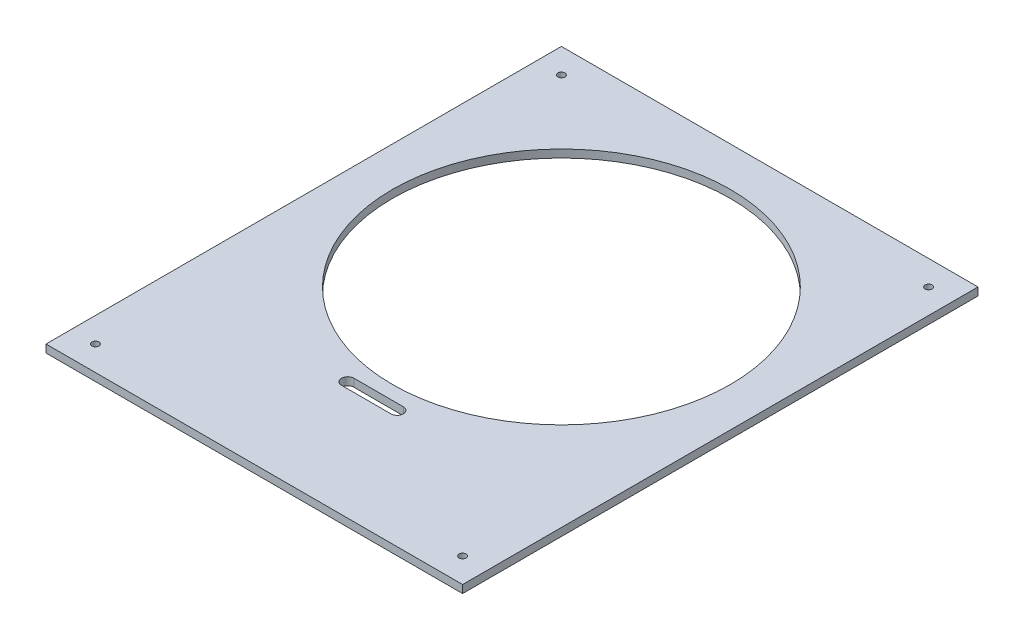
ISO-10303-21;
HEADER;
FILE_DESCRIPTION(('STEP AP214'),'2;1');
FILE_NAME('part.step','',(''),(''),'','','');
FILE_SCHEMA(('AUTOMOTIVE_DESIGN { 1 0 10303 214 1 1 1 1 }'));
ENDSEC;
DATA;
#1=APPLICATION_CONTEXT('core data for automotive mechanical design processes');
#2=APPLICATION_PROTOCOL_DEFINITION('international standard','automotive_design',2000,#1);
#3=PRODUCT_CONTEXT('',#1,'mechanical');
#4=PRODUCT('Part','Part','',(#3));
#5=PRODUCT_RELATED_PRODUCT_CATEGORY('part','',(#4));
#6=PRODUCT_DEFINITION_FORMATION('','',#4);
#7=PRODUCT_DEFINITION_CONTEXT('part definition',#1,'design');
#8=PRODUCT_DEFINITION('design','',#6,#7);
#9=PRODUCT_DEFINITION_SHAPE('','',#8);
#10=(LENGTH_UNIT() NAMED_UNIT(*) SI_UNIT(.MILLI.,.METRE.));
#11=(NAMED_UNIT(*) PLANE_ANGLE_UNIT() SI_UNIT($,.RADIAN.));
#12=(NAMED_UNIT(*) SI_UNIT($,.STERADIAN.) SOLID_ANGLE_UNIT());
#13=UNCERTAINTY_MEASURE_WITH_UNIT(LENGTH_MEASURE(1.E-05),#10,'distance_accuracy_value','');
#14=(GEOMETRIC_REPRESENTATION_CONTEXT(3) GLOBAL_UNCERTAINTY_ASSIGNED_CONTEXT((#13)) GLOBAL_UNIT_ASSIGNED_CONTEXT((#10,
#11,#12)) REPRESENTATION_CONTEXT('',''));
#15=CARTESIAN_POINT('',(0.,0.,0.));
#16=DIRECTION('',(0.,0.,1.));
#17=DIRECTION('',(1.,0.,0.));
#18=AXIS2_PLACEMENT_3D('',#15,#16,#17);
#19=CARTESIAN_POINT('',(0.,3.175,0.));
#20=DIRECTION('',(0.,1.,0.));
#21=DIRECTION('',(0.,0.,1.));
#22=AXIS2_PLACEMENT_3D('',#19,#20,#21);
#23=PLANE('',#22);
#24=CARTESIAN_POINT('',(74.325,3.175,114.325));
#25=DIRECTION('',(0.,1.,0.));
#26=DIRECTION('',(0.,0.,1.));
#27=AXIS2_PLACEMENT_3D('',#24,#25,#26);
#28=CIRCLE('',#27,1.42240000000001);
#29=CARTESIAN_POINT('',(74.325,3.175,115.7474));
#30=VERTEX_POINT('',#29);
#31=EDGE_CURVE('E223',#30,#30,#28,.T.);
#32=ORIENTED_EDGE('',*,*,#31,.F.);
#33=EDGE_LOOP('',(#32));
#34=FACE_BOUND('',#33,.T.);
#35=CARTESIAN_POINT('',(-74.325,3.175,-74.325));
#36=DIRECTION('',(0.,1.,0.));
#37=DIRECTION('',(0.,0.,1.));
#38=AXIS2_PLACEMENT_3D('',#35,#36,#37);
#39=CIRCLE('',#38,1.42240000000001);
#40=CARTESIAN_POINT('',(-74.325,3.175,-72.9026));
#41=VERTEX_POINT('',#40);
#42=EDGE_CURVE('E227',#41,#41,#39,.T.);
#43=ORIENTED_EDGE('',*,*,#42,.F.);
#44=EDGE_LOOP('',(#43));
#45=FACE_BOUND('',#44,.T.);
#46=CARTESIAN_POINT('',(74.3250000000002,3.175,-74.325));
#47=DIRECTION('',(0.,1.,0.));
#48=DIRECTION('',(0.,0.,1.));
#49=AXIS2_PLACEMENT_3D('',#46,#47,#48);
#50=CIRCLE('',#49,1.42240000000001);
#51=CARTESIAN_POINT('',(74.3250000000002,3.175,-72.9026));
#52=VERTEX_POINT('',#51);
#53=EDGE_CURVE('E231',#52,#52,#50,.T.);
#54=ORIENTED_EDGE('',*,*,#53,.F.);
#55=EDGE_LOOP('',(#54));
#56=FACE_BOUND('',#55,.T.);
#57=CARTESIAN_POINT('',(-74.325,3.175,114.325));
#58=DIRECTION('',(0.,1.,0.));
#59=DIRECTION('',(0.,0.,1.));
#60=AXIS2_PLACEMENT_3D('',#57,#58,#59);
#61=CIRCLE('',#60,1.42240000000001);
#62=CARTESIAN_POINT('',(-74.325,3.175,115.7474));
#63=VERTEX_POINT('',#62);
#64=EDGE_CURVE('E235',#63,#63,#61,.T.);
#65=ORIENTED_EDGE('',*,*,#64,.F.);
#66=EDGE_LOOP('',(#65));
#67=FACE_BOUND('',#66,.T.);
#68=CARTESIAN_POINT('',(10.,3.175,76.495));
#69=DIRECTION('',(0.,1.,0.));
#70=DIRECTION('',(0.,0.,1.));
#71=AXIS2_PLACEMENT_3D('',#68,#69,#70);
#72=CIRCLE('',#71,2.5);
#73=CARTESIAN_POINT('',(10.,3.175,78.995));
#74=VERTEX_POINT('',#73);
#75=CARTESIAN_POINT('',(10.,3.175,73.995));
#76=VERTEX_POINT('',#75);
#77=EDGE_CURVE('E52',#74,#76,#72,.T.);
#78=ORIENTED_EDGE('',*,*,#77,.F.);
#79=DIRECTION('',(1.,0.,0.));
#80=VECTOR('',#79,1.);
#81=CARTESIAN_POINT('',(10.,3.175,78.995));
#82=LINE('',#81,#80);
#83=CARTESIAN_POINT('',(-10.,3.175,78.995));
#84=VERTEX_POINT('',#83);
#85=EDGE_CURVE('E146',#84,#74,#82,.T.);
#86=ORIENTED_EDGE('',*,*,#85,.F.);
#87=CARTESIAN_POINT('',(-10.,3.175,76.495));
#88=DIRECTION('',(0.,1.,0.));
#89=DIRECTION('',(0.,0.,1.));
#90=AXIS2_PLACEMENT_3D('',#87,#88,#89);
#91=CIRCLE('',#90,2.5);
#92=CARTESIAN_POINT('',(-10.,3.175,73.995));
#93=VERTEX_POINT('',#92);
#94=EDGE_CURVE('E158',#93,#84,#91,.T.);
#95=ORIENTED_EDGE('',*,*,#94,.F.);
#96=DIRECTION('',(-1.,0.,0.));
#97=VECTOR('',#96,1.);
#98=CARTESIAN_POINT('',(10.,3.175,73.995));
#99=LINE('',#98,#97);
#100=EDGE_CURVE('E155',#76,#93,#99,.T.);
#101=ORIENTED_EDGE('',*,*,#100,.F.);
#102=EDGE_LOOP('',(#78,#86,#95,#101));
#103=FACE_BOUND('',#102,.T.);
#104=DIRECTION('',(0.,0.,1.));
#105=VECTOR('',#104,1.);
#106=CARTESIAN_POINT('',(-84.325,3.175,84.325));
#107=LINE('',#106,#105);
#108=CARTESIAN_POINT('',(-84.325,3.175,-84.325));
#109=VERTEX_POINT('',#108);
#110=CARTESIAN_POINT('',(-84.325,3.175,124.325));
#111=VERTEX_POINT('',#110);
#112=EDGE_CURVE('E176',#109,#111,#107,.T.);
#113=ORIENTED_EDGE('',*,*,#112,.T.);
#114=DIRECTION('',(1.,0.,0.));
#115=VECTOR('',#114,1.);
#116=CARTESIAN_POINT('',(-84.325,3.175,124.325));
#117=LINE('',#116,#115);
#118=CARTESIAN_POINT('',(84.325,3.175,124.325));
#119=VERTEX_POINT('',#118);
#120=EDGE_CURVE('E115',#111,#119,#117,.T.);
#121=ORIENTED_EDGE('',*,*,#120,.T.);
#122=DIRECTION('',(0.,0.,-1.));
#123=VECTOR('',#122,1.);
#124=CARTESIAN_POINT('',(84.325,3.175,84.325));
#125=LINE('',#124,#123);
#126=CARTESIAN_POINT('',(84.325,3.175,-84.325));
#127=VERTEX_POINT('',#126);
#128=EDGE_CURVE('E178',#119,#127,#125,.T.);
#129=ORIENTED_EDGE('',*,*,#128,.T.);
#130=DIRECTION('',(-1.,0.,0.));
#131=VECTOR('',#130,1.);
#132=CARTESIAN_POINT('',(84.325,3.175,-84.325));
#133=LINE('',#132,#131);
#134=EDGE_CURVE('E181',#127,#109,#133,.T.);
#135=ORIENTED_EDGE('',*,*,#134,.T.);
#136=EDGE_LOOP('',(#113,#121,#129,#135));
#137=FACE_BOUND('',#136,.T.);
#138=CARTESIAN_POINT('',(0.,3.175,0.));
#139=DIRECTION('',(0.,1.,0.));
#140=DIRECTION('',(0.,0.,1.));
#141=AXIS2_PLACEMENT_3D('',#138,#139,#140);
#142=CIRCLE('',#141,68.4);
#143=CARTESIAN_POINT('',(0.,3.175,68.4));
#144=VERTEX_POINT('',#143);
#145=EDGE_CURVE('E171',#144,#144,#142,.T.);
#146=ORIENTED_EDGE('',*,*,#145,.F.);
#147=EDGE_LOOP('',(#146));
#148=FACE_BOUND('',#147,.T.);
#149=ADVANCED_FACE('F35',(#34,#45,#56,#67,#103,#137,#148),#23,.T.);
#150=CARTESIAN_POINT('',(0.,0.,0.));
#151=DIRECTION('',(0.,1.,0.));
#152=DIRECTION('',(0.,0.,1.));
#153=AXIS2_PLACEMENT_3D('',#150,#151,#152);
#154=PLANE('',#153);
#155=CARTESIAN_POINT('',(-74.325,0.,-74.325));
#156=DIRECTION('',(0.,1.,0.));
#157=DIRECTION('',(0.,0.,1.));
#158=AXIS2_PLACEMENT_3D('',#155,#156,#157);
#159=CIRCLE('',#158,1.42240000000001);
#160=CARTESIAN_POINT('',(-74.325,0.,-72.9026));
#161=VERTEX_POINT('',#160);
#162=EDGE_CURVE('E39',#161,#161,#159,.T.);
#163=ORIENTED_EDGE('',*,*,#162,.T.);
#164=EDGE_LOOP('',(#163));
#165=FACE_BOUND('',#164,.T.);
#166=CARTESIAN_POINT('',(74.3250000000002,0.,-74.325));
#167=DIRECTION('',(0.,1.,0.));
#168=DIRECTION('',(0.,0.,1.));
#169=AXIS2_PLACEMENT_3D('',#166,#167,#168);
#170=CIRCLE('',#169,1.42240000000001);
#171=CARTESIAN_POINT('',(74.3250000000002,0.,-72.9026));
#172=VERTEX_POINT('',#171);
#173=EDGE_CURVE('E285',#172,#172,#170,.T.);
#174=ORIENTED_EDGE('',*,*,#173,.T.);
#175=EDGE_LOOP('',(#174));
#176=FACE_BOUND('',#175,.T.);
#177=DIRECTION('',(1.,0.,0.));
#178=VECTOR('',#177,1.);
#179=CARTESIAN_POINT('',(10.,0.,78.995));
#180=LINE('',#179,#178);
#181=CARTESIAN_POINT('',(-10.,0.,78.995));
#182=VERTEX_POINT('',#181);
#183=CARTESIAN_POINT('',(10.,0.,78.995));
#184=VERTEX_POINT('',#183);
#185=EDGE_CURVE('E150',#182,#184,#180,.T.);
#186=ORIENTED_EDGE('',*,*,#185,.T.);
#187=CARTESIAN_POINT('',(10.,0.,76.495));
#188=DIRECTION('',(0.,1.,0.));
#189=DIRECTION('',(0.,0.,1.));
#190=AXIS2_PLACEMENT_3D('',#187,#188,#189);
#191=CIRCLE('',#190,2.5);
#192=CARTESIAN_POINT('',(10.,0.,73.995));
#193=VERTEX_POINT('',#192);
#194=EDGE_CURVE('E142',#184,#193,#191,.T.);
#195=ORIENTED_EDGE('',*,*,#194,.T.);
#196=DIRECTION('',(-1.,0.,0.));
#197=VECTOR('',#196,1.);
#198=CARTESIAN_POINT('',(10.,0.,73.995));
#199=LINE('',#198,#197);
#200=CARTESIAN_POINT('',(-10.,0.,73.995));
#201=VERTEX_POINT('',#200);
#202=EDGE_CURVE('E145',#193,#201,#199,.T.);
#203=ORIENTED_EDGE('',*,*,#202,.T.);
#204=CARTESIAN_POINT('',(-10.,0.,76.495));
#205=DIRECTION('',(0.,1.,0.));
#206=DIRECTION('',(0.,0.,1.));
#207=AXIS2_PLACEMENT_3D('',#204,#205,#206);
#208=CIRCLE('',#207,2.5);
#209=EDGE_CURVE('E60',#201,#182,#208,.T.);
#210=ORIENTED_EDGE('',*,*,#209,.T.);
#211=EDGE_LOOP('',(#186,#195,#203,#210));
#212=FACE_BOUND('',#211,.T.);
#213=DIRECTION('',(0.,0.,1.));
#214=VECTOR('',#213,1.);
#215=CARTESIAN_POINT('',(-84.325,0.,84.325));
#216=LINE('',#215,#214);
#217=CARTESIAN_POINT('',(-84.325,0.,-84.325));
#218=VERTEX_POINT('',#217);
#219=CARTESIAN_POINT('',(-84.325,-0.00250000000000011,84.325));
#220=VERTEX_POINT('',#219);
#221=EDGE_CURVE('E132',#218,#220,#216,.T.);
#222=ORIENTED_EDGE('',*,*,#221,.F.);
#223=DIRECTION('',(-1.,0.,0.));
#224=VECTOR('',#223,1.);
#225=CARTESIAN_POINT('',(84.325,0.,-84.325));
#226=LINE('',#225,#224);
#227=CARTESIAN_POINT('',(84.325,0.,-84.325));
#228=VERTEX_POINT('',#227);
#229=EDGE_CURVE('E179',#228,#218,#226,.T.);
#230=ORIENTED_EDGE('',*,*,#229,.F.);
#231=DIRECTION('',(0.,0.,-1.));
#232=VECTOR('',#231,1.);
#233=CARTESIAN_POINT('',(84.325,0.,84.325));
#234=LINE('',#233,#232);
#235=CARTESIAN_POINT('',(84.325,-0.00250000000000011,84.325));
#236=VERTEX_POINT('',#235);
#237=EDGE_CURVE('E184',#236,#228,#234,.T.);
#238=ORIENTED_EDGE('',*,*,#237,.F.);
#239=CARTESIAN_POINT('',(-84.325,-0.00500000000000023,84.325));
#240=DIRECTION('',(1.,0.,0.));
#241=VECTOR('',#240,1.);
#242=LINE('',#239,#241);
#243=EDGE_CURVE('E188',#220,#236,#242,.T.);
#244=ORIENTED_EDGE('',*,*,#243,.F.);
#245=EDGE_LOOP('',(#222,#230,#238,#244));
#246=FACE_BOUND('',#245,.T.);
#247=CARTESIAN_POINT('',(0.,0.,0.));
#248=DIRECTION('',(0.,1.,0.));
#249=DIRECTION('',(0.,0.,1.));
#250=AXIS2_PLACEMENT_3D('',#247,#248,#249);
#251=CIRCLE('',#250,68.4);
#252=CARTESIAN_POINT('',(0.,0.,68.4));
#253=VERTEX_POINT('',#252);
#254=EDGE_CURVE('E165',#253,#253,#251,.T.);
#255=ORIENTED_EDGE('',*,*,#254,.T.);
#256=EDGE_LOOP('',(#255));
#257=FACE_BOUND('',#256,.T.);
#258=ADVANCED_FACE('F194',(#165,#176,#212,#246,#257),#154,.F.);
#259=CARTESIAN_POINT('',(-84.325,3.175,84.325));
#260=DIRECTION('',(1.,0.,0.));
#261=DIRECTION('',(0.,0.,-1.));
#262=AXIS2_PLACEMENT_3D('',#259,#260,#261);
#263=PLANE('',#262);
#264=ORIENTED_EDGE('',*,*,#221,.T.);
#265=DIRECTION('',(0.,0.,1.));
#266=VECTOR('',#265,1.);
#267=CARTESIAN_POINT('',(-84.325,-0.00500000000000023,84.325));
#268=LINE('',#267,#266);
#269=CARTESIAN_POINT('',(-84.325,-0.00500000000000023,124.325));
#270=VERTEX_POINT('',#269);
#271=EDGE_CURVE('E127',#220,#270,#268,.T.);
#272=ORIENTED_EDGE('',*,*,#271,.T.);
#273=DIRECTION('',(0.,1.,0.));
#274=VECTOR('',#273,1.);
#275=CARTESIAN_POINT('',(-84.325,-0.00500000000000023,124.325));
#276=LINE('',#275,#274);
#277=EDGE_CURVE('E109',#270,#111,#276,.T.);
#278=ORIENTED_EDGE('',*,*,#277,.T.);
#279=ORIENTED_EDGE('',*,*,#112,.F.);
#280=DIRECTION('',(0.,-1.,0.));
#281=VECTOR('',#280,1.);
#282=CARTESIAN_POINT('',(-84.325,3.175,-84.325));
#283=LINE('',#282,#281);
#284=EDGE_CURVE('E44',#109,#218,#283,.T.);
#285=ORIENTED_EDGE('',*,*,#284,.T.);
#286=EDGE_LOOP('',(#264,#272,#278,#279,#285));
#287=FACE_BOUND('',#286,.T.);
#288=ADVANCED_FACE('F37',(#287),#263,.F.);
#289=CARTESIAN_POINT('',(84.325,3.175,84.325));
#290=DIRECTION('',(-1.,0.,0.));
#291=DIRECTION('',(0.,0.,1.));
#292=AXIS2_PLACEMENT_3D('',#289,#290,#291);
#293=PLANE('',#292);
#294=ORIENTED_EDGE('',*,*,#237,.T.);
#295=DIRECTION('',(0.,-1.,0.));
#296=VECTOR('',#295,1.);
#297=CARTESIAN_POINT('',(84.325,3.175,-84.325));
#298=LINE('',#297,#296);
#299=EDGE_CURVE('E11',#127,#228,#298,.T.);
#300=ORIENTED_EDGE('',*,*,#299,.F.);
#301=ORIENTED_EDGE('',*,*,#128,.F.);
#302=DIRECTION('',(0.,1.,0.));
#303=VECTOR('',#302,1.);
#304=CARTESIAN_POINT('',(84.325,-0.00500000000000023,124.325));
#305=LINE('',#304,#303);
#306=CARTESIAN_POINT('',(84.325,-0.00500000000000023,124.325));
#307=VERTEX_POINT('',#306);
#308=EDGE_CURVE('E119',#307,#119,#305,.T.);
#309=ORIENTED_EDGE('',*,*,#308,.F.);
#310=DIRECTION('',(0.,0.,-1.));
#311=VECTOR('',#310,1.);
#312=CARTESIAN_POINT('',(84.325,-0.00500000000000023,84.325));
#313=LINE('',#312,#311);
#314=EDGE_CURVE('E120',#307,#236,#313,.T.);
#315=ORIENTED_EDGE('',*,*,#314,.T.);
#316=EDGE_LOOP('',(#294,#300,#301,#309,#315));
#317=FACE_BOUND('',#316,.T.);
#318=ADVANCED_FACE('F209',(#317),#293,.F.);
#319=CARTESIAN_POINT('',(84.325,3.175,-84.325));
#320=DIRECTION('',(0.,0.,1.));
#321=DIRECTION('',(1.,0.,0.));
#322=AXIS2_PLACEMENT_3D('',#319,#320,#321);
#323=PLANE('',#322);
#324=ORIENTED_EDGE('',*,*,#229,.T.);
#325=ORIENTED_EDGE('',*,*,#284,.F.);
#326=ORIENTED_EDGE('',*,*,#134,.F.);
#327=ORIENTED_EDGE('',*,*,#299,.T.);
#328=EDGE_LOOP('',(#324,#325,#326,#327));
#329=FACE_BOUND('',#328,.T.);
#330=ADVANCED_FACE('F206',(#329),#323,.F.);
#331=CARTESIAN_POINT('',(0.,3.175,0.));
#332=DIRECTION('',(0.,-1.,0.));
#333=DIRECTION('',(0.,0.,-1.));
#334=AXIS2_PLACEMENT_3D('',#331,#332,#333);
#335=CYLINDRICAL_SURFACE('',#334,68.4);
#336=ORIENTED_EDGE('',*,*,#145,.T.);
#337=EDGE_LOOP('',(#336));
#338=FACE_BOUND('',#337,.T.);
#339=ORIENTED_EDGE('',*,*,#254,.F.);
#340=EDGE_LOOP('',(#339));
#341=FACE_BOUND('',#340,.T.);
#342=ADVANCED_FACE('F208',(#338,#341),#335,.F.);
#343=CARTESIAN_POINT('',(10.,0.,76.495));
#344=DIRECTION('',(0.,1.,0.));
#345=DIRECTION('',(0.,0.,1.));
#346=AXIS2_PLACEMENT_3D('',#343,#344,#345);
#347=CYLINDRICAL_SURFACE('',#346,2.5);
#348=ORIENTED_EDGE('',*,*,#77,.T.);
#349=DIRECTION('',(0.,1.,0.));
#350=VECTOR('',#349,1.);
#351=CARTESIAN_POINT('',(10.,0.,73.995));
#352=LINE('',#351,#350);
#353=EDGE_CURVE('E153',#193,#76,#352,.T.);
#354=ORIENTED_EDGE('',*,*,#353,.F.);
#355=ORIENTED_EDGE('',*,*,#194,.F.);
#356=DIRECTION('',(0.,1.,0.));
#357=VECTOR('',#356,1.);
#358=CARTESIAN_POINT('',(10.,0.,78.995));
#359=LINE('',#358,#357);
#360=EDGE_CURVE('E163',#184,#74,#359,.T.);
#361=ORIENTED_EDGE('',*,*,#360,.T.);
#362=EDGE_LOOP('',(#348,#354,#355,#361));
#363=FACE_BOUND('',#362,.T.);
#364=ADVANCED_FACE('F244',(#363),#347,.F.);
#365=CARTESIAN_POINT('',(10.,0.,78.995));
#366=DIRECTION('',(0.,0.,1.));
#367=DIRECTION('',(1.,0.,0.));
#368=AXIS2_PLACEMENT_3D('',#365,#366,#367);
#369=PLANE('',#368);
#370=ORIENTED_EDGE('',*,*,#85,.T.);
#371=ORIENTED_EDGE('',*,*,#360,.F.);
#372=ORIENTED_EDGE('',*,*,#185,.F.);
#373=DIRECTION('',(0.,1.,0.));
#374=VECTOR('',#373,1.);
#375=CARTESIAN_POINT('',(-10.,0.,78.995));
#376=LINE('',#375,#374);
#377=EDGE_CURVE('E166',#182,#84,#376,.T.);
#378=ORIENTED_EDGE('',*,*,#377,.T.);
#379=EDGE_LOOP('',(#370,#371,#372,#378));
#380=FACE_BOUND('',#379,.T.);
#381=ADVANCED_FACE('F250',(#380),#369,.F.);
#382=CARTESIAN_POINT('',(-10.,0.,76.495));
#383=DIRECTION('',(0.,1.,0.));
#384=DIRECTION('',(0.,0.,1.));
#385=AXIS2_PLACEMENT_3D('',#382,#383,#384);
#386=CYLINDRICAL_SURFACE('',#385,2.5);
#387=ORIENTED_EDGE('',*,*,#94,.T.);
#388=ORIENTED_EDGE('',*,*,#377,.F.);
#389=ORIENTED_EDGE('',*,*,#209,.F.);
#390=DIRECTION('',(0.,1.,0.));
#391=VECTOR('',#390,1.);
#392=CARTESIAN_POINT('',(-10.,0.,73.995));
#393=LINE('',#392,#391);
#394=EDGE_CURVE('E168',#201,#93,#393,.T.);
#395=ORIENTED_EDGE('',*,*,#394,.T.);
#396=EDGE_LOOP('',(#387,#388,#389,#395));
#397=FACE_BOUND('',#396,.T.);
#398=ADVANCED_FACE('F256',(#397),#386,.F.);
#399=CARTESIAN_POINT('',(10.,0.,73.995));
#400=DIRECTION('',(0.,0.,-1.));
#401=DIRECTION('',(-1.,0.,0.));
#402=AXIS2_PLACEMENT_3D('',#399,#400,#401);
#403=PLANE('',#402);
#404=ORIENTED_EDGE('',*,*,#100,.T.);
#405=ORIENTED_EDGE('',*,*,#394,.F.);
#406=ORIENTED_EDGE('',*,*,#202,.F.);
#407=ORIENTED_EDGE('',*,*,#353,.T.);
#408=EDGE_LOOP('',(#404,#405,#406,#407));
#409=FACE_BOUND('',#408,.T.);
#410=ADVANCED_FACE('F253',(#409),#403,.F.);
#411=CARTESIAN_POINT('',(-84.325,-0.00500000000000023,124.325));
#412=DIRECTION('',(0.,0.,1.));
#413=DIRECTION('',(1.,0.,0.));
#414=AXIS2_PLACEMENT_3D('',#411,#412,#413);
#415=PLANE('',#414);
#416=ORIENTED_EDGE('',*,*,#120,.F.);
#417=ORIENTED_EDGE('',*,*,#277,.F.);
#418=DIRECTION('',(1.,0.,0.));
#419=VECTOR('',#418,1.);
#420=CARTESIAN_POINT('',(-84.325,-0.00500000000000023,124.325));
#421=LINE('',#420,#419);
#422=EDGE_CURVE('E113',#270,#307,#421,.T.);
#423=ORIENTED_EDGE('',*,*,#422,.T.);
#424=ORIENTED_EDGE('',*,*,#308,.T.);
#425=EDGE_LOOP('',(#416,#417,#423,#424));
#426=FACE_BOUND('',#425,.T.);
#427=ADVANCED_FACE('F111',(#426),#415,.T.);
#428=CARTESIAN_POINT('',(0.,-0.00500000000000023,0.));
#429=DIRECTION('',(0.,1.,0.));
#430=DIRECTION('',(0.,0.,1.));
#431=AXIS2_PLACEMENT_3D('',#428,#429,#430);
#432=PLANE('',#431);
#433=CARTESIAN_POINT('',(74.325,-0.00500000000000023,114.325));
#434=DIRECTION('',(0.,1.,0.));
#435=DIRECTION('',(0.,0.,1.));
#436=AXIS2_PLACEMENT_3D('',#433,#434,#435);
#437=CIRCLE('',#436,1.42240000000001);
#438=CARTESIAN_POINT('',(74.325,-0.00500000000000023,115.7474));
#439=VERTEX_POINT('',#438);
#440=EDGE_CURVE('E295',#439,#439,#437,.T.);
#441=ORIENTED_EDGE('',*,*,#440,.T.);
#442=EDGE_LOOP('',(#441));
#443=FACE_BOUND('',#442,.T.);
#444=CARTESIAN_POINT('',(-74.325,-0.00500000000000023,114.325));
#445=DIRECTION('',(0.,1.,0.));
#446=DIRECTION('',(0.,0.,1.));
#447=AXIS2_PLACEMENT_3D('',#444,#445,#446);
#448=CIRCLE('',#447,1.42240000000001);
#449=CARTESIAN_POINT('',(-74.325,-0.00500000000000023,115.7474));
#450=VERTEX_POINT('',#449);
#451=EDGE_CURVE('E287',#450,#450,#448,.T.);
#452=ORIENTED_EDGE('',*,*,#451,.T.);
#453=EDGE_LOOP('',(#452));
#454=FACE_BOUND('',#453,.T.);
#455=ORIENTED_EDGE('',*,*,#271,.F.);
#456=ORIENTED_EDGE('',*,*,#243,.T.);
#457=ORIENTED_EDGE('',*,*,#314,.F.);
#458=ORIENTED_EDGE('',*,*,#422,.F.);
#459=EDGE_LOOP('',(#455,#456,#457,#458));
#460=FACE_BOUND('',#459,.T.);
#461=ADVANCED_FACE('F125',(#443,#454,#460),#432,.F.);
#462=CARTESIAN_POINT('',(-74.325,-0.00500000000000023,114.325));
#463=DIRECTION('',(0.,1.,0.));
#464=DIRECTION('',(0.,0.,1.));
#465=AXIS2_PLACEMENT_3D('',#462,#463,#464);
#466=CYLINDRICAL_SURFACE('',#465,1.42240000000001);
#467=CARTESIAN_POINT('',(-74.325,-0.00500000000000023,115.7474));
#468=CARTESIAN_POINT('',(-74.325,0.0281249999999997,115.7474));
#469=CARTESIAN_POINT('',(-74.325,0.0612499999999998,115.7474));
#470=CARTESIAN_POINT('',(-74.325,0.1275,115.7474));
#471=CARTESIAN_POINT('',(-74.325,0.160625,115.7474));
#472=CARTESIAN_POINT('',(-74.325,0.226875,115.7474));
#473=CARTESIAN_POINT('',(-74.325,0.26,115.7474));
#474=CARTESIAN_POINT('',(-74.325,0.32625,115.7474));
#475=CARTESIAN_POINT('',(-74.325,0.359375,115.7474));
#476=CARTESIAN_POINT('',(-74.325,0.425625,115.7474));
#477=CARTESIAN_POINT('',(-74.325,0.45875,115.7474));
#478=CARTESIAN_POINT('',(-74.325,0.525,115.7474));
#479=CARTESIAN_POINT('',(-74.325,0.558125,115.7474));
#480=CARTESIAN_POINT('',(-74.325,0.624375,115.7474));
#481=CARTESIAN_POINT('',(-74.325,0.6575,115.7474));
#482=CARTESIAN_POINT('',(-74.325,0.72375,115.7474));
#483=CARTESIAN_POINT('',(-74.325,0.756875,115.7474));
#484=CARTESIAN_POINT('',(-74.325,0.823125,115.7474));
#485=CARTESIAN_POINT('',(-74.325,0.85625,115.7474));
#486=CARTESIAN_POINT('',(-74.325,0.9225,115.7474));
#487=CARTESIAN_POINT('',(-74.325,0.955625,115.7474));
#488=CARTESIAN_POINT('',(-74.325,1.021875,115.7474));
#489=CARTESIAN_POINT('',(-74.325,1.055,115.7474));
#490=CARTESIAN_POINT('',(-74.325,1.12125,115.7474));
#491=CARTESIAN_POINT('',(-74.325,1.154375,115.7474));
#492=CARTESIAN_POINT('',(-74.325,1.220625,115.7474));
#493=CARTESIAN_POINT('',(-74.325,1.25375,115.7474));
#494=CARTESIAN_POINT('',(-74.325,1.32,115.7474));
#495=CARTESIAN_POINT('',(-74.325,1.353125,115.7474));
#496=CARTESIAN_POINT('',(-74.325,1.419375,115.7474));
#497=CARTESIAN_POINT('',(-74.325,1.4525,115.7474));
#498=CARTESIAN_POINT('',(-74.325,1.51875,115.7474));
#499=CARTESIAN_POINT('',(-74.325,1.551875,115.7474));
#500=CARTESIAN_POINT('',(-74.325,1.618125,115.7474));
#501=CARTESIAN_POINT('',(-74.325,1.65125,115.7474));
#502=CARTESIAN_POINT('',(-74.325,1.7175,115.7474));
#503=CARTESIAN_POINT('',(-74.325,1.750625,115.7474));
#504=CARTESIAN_POINT('',(-74.325,1.816875,115.7474));
#505=CARTESIAN_POINT('',(-74.325,1.85,115.7474));
#506=CARTESIAN_POINT('',(-74.325,1.91625,115.7474));
#507=CARTESIAN_POINT('',(-74.325,1.949375,115.7474));
#508=CARTESIAN_POINT('',(-74.325,2.015625,115.7474));
#509=CARTESIAN_POINT('',(-74.325,2.04875,115.7474));
#510=CARTESIAN_POINT('',(-74.325,2.115,115.7474));
#511=CARTESIAN_POINT('',(-74.325,2.148125,115.7474));
#512=CARTESIAN_POINT('',(-74.325,2.214375,115.7474));
#513=CARTESIAN_POINT('',(-74.325,2.2475,115.7474));
#514=CARTESIAN_POINT('',(-74.325,2.31375,115.7474));
#515=CARTESIAN_POINT('',(-74.325,2.346875,115.7474));
#516=CARTESIAN_POINT('',(-74.325,2.413125,115.7474));
#517=CARTESIAN_POINT('',(-74.325,2.44625,115.7474));
#518=CARTESIAN_POINT('',(-74.325,2.5125,115.7474));
#519=CARTESIAN_POINT('',(-74.325,2.545625,115.7474));
#520=CARTESIAN_POINT('',(-74.325,2.611875,115.7474));
#521=CARTESIAN_POINT('',(-74.325,2.645,115.7474));
#522=CARTESIAN_POINT('',(-74.325,2.71125,115.7474));
#523=CARTESIAN_POINT('',(-74.325,2.744375,115.7474));
#524=CARTESIAN_POINT('',(-74.325,2.810625,115.7474));
#525=CARTESIAN_POINT('',(-74.325,2.84375,115.7474));
#526=CARTESIAN_POINT('',(-74.325,2.91,115.7474));
#527=CARTESIAN_POINT('',(-74.325,2.943125,115.7474));
#528=CARTESIAN_POINT('',(-74.325,3.009375,115.7474));
#529=CARTESIAN_POINT('',(-74.325,3.0425,115.7474));
#530=CARTESIAN_POINT('',(-74.325,3.10875,115.7474));
#531=CARTESIAN_POINT('',(-74.325,3.141875,115.7474));
#532=CARTESIAN_POINT('',(-74.325,3.175,115.7474));
#533=B_SPLINE_CURVE_WITH_KNOTS('',3,(#467,#468,#469,#470,#471,#472,#473,#474,#475,#476,#477,
#478,#479,#480,#481,#482,#483,#484,#485,#486,#487,#488,#489,#490,#491,#492,#493,#494,#495,#496,
#497,#498,#499,#500,#501,#502,#503,#504,#505,#506,#507,#508,#509,#510,#511,#512,#513,#514,#515,
#516,#517,#518,#519,#520,#521,#522,#523,#524,#525,#526,#527,#528,#529,#530,#531,#532),
.UNSPECIFIED.,.F.,.F.,(4,2,2,2,2,2,2,2,2,2,2,2,2,2,2,2,2,2,2,2,2,2,2,2,2,2,2,2,2,2,2,2,4),(0.,
0.099375,0.19875,0.298125,0.3975,0.496875,0.59625,0.695625,0.795,0.894375,0.99375,1.093125,
1.1925,1.291875,1.39125,1.490625,1.59,1.689375,1.78875,1.888125,1.9875,2.086875,2.18625,
2.285625,2.385,2.484375,2.58375,2.683125,2.7825,2.881875,2.98125,3.080625,3.18),.UNSPECIFIED.);
#534=EDGE_CURVE('BSEAM268',#450,#63,#533,.T.);
#535=ORIENTED_EDGE('',*,*,#451,.F.);
#536=ORIENTED_EDGE('',*,*,#64,.T.);
#537=ORIENTED_EDGE('',*,*,#534,.T.);
#538=ORIENTED_EDGE('',*,*,#534,.F.);
#539=EDGE_LOOP('',(#535,#537,#536,#538));
#540=FACE_BOUND('',#539,.T.);
#541=ADVANCED_FACE('F268',(#540),#466,.F.);
#542=CARTESIAN_POINT('',(74.325,-0.00500000000000023,114.325));
#543=DIRECTION('',(0.,1.,0.));
#544=DIRECTION('',(0.,0.,1.));
#545=AXIS2_PLACEMENT_3D('',#542,#543,#544);
#546=CYLINDRICAL_SURFACE('',#545,1.42240000000001);
#547=CARTESIAN_POINT('',(74.325,-0.00500000000000023,115.7474));
#548=CARTESIAN_POINT('',(74.325,0.0281249999999997,115.7474));
#549=CARTESIAN_POINT('',(74.325,0.0612499999999998,115.7474));
#550=CARTESIAN_POINT('',(74.325,0.1275,115.7474));
#551=CARTESIAN_POINT('',(74.325,0.160625,115.7474));
#552=CARTESIAN_POINT('',(74.325,0.226875,115.7474));
#553=CARTESIAN_POINT('',(74.325,0.26,115.7474));
#554=CARTESIAN_POINT('',(74.325,0.32625,115.7474));
#555=CARTESIAN_POINT('',(74.325,0.359375,115.7474));
#556=CARTESIAN_POINT('',(74.325,0.425625,115.7474));
#557=CARTESIAN_POINT('',(74.325,0.45875,115.7474));
#558=CARTESIAN_POINT('',(74.325,0.525,115.7474));
#559=CARTESIAN_POINT('',(74.325,0.558125,115.7474));
#560=CARTESIAN_POINT('',(74.325,0.624375,115.7474));
#561=CARTESIAN_POINT('',(74.325,0.6575,115.7474));
#562=CARTESIAN_POINT('',(74.325,0.72375,115.7474));
#563=CARTESIAN_POINT('',(74.325,0.756875,115.7474));
#564=CARTESIAN_POINT('',(74.325,0.823125,115.7474));
#565=CARTESIAN_POINT('',(74.325,0.85625,115.7474));
#566=CARTESIAN_POINT('',(74.325,0.9225,115.7474));
#567=CARTESIAN_POINT('',(74.325,0.955625,115.7474));
#568=CARTESIAN_POINT('',(74.325,1.021875,115.7474));
#569=CARTESIAN_POINT('',(74.325,1.055,115.7474));
#570=CARTESIAN_POINT('',(74.325,1.12125,115.7474));
#571=CARTESIAN_POINT('',(74.325,1.154375,115.7474));
#572=CARTESIAN_POINT('',(74.325,1.220625,115.7474));
#573=CARTESIAN_POINT('',(74.325,1.25375,115.7474));
#574=CARTESIAN_POINT('',(74.325,1.32,115.7474));
#575=CARTESIAN_POINT('',(74.325,1.353125,115.7474));
#576=CARTESIAN_POINT('',(74.325,1.419375,115.7474));
#577=CARTESIAN_POINT('',(74.325,1.4525,115.7474));
#578=CARTESIAN_POINT('',(74.325,1.51875,115.7474));
#579=CARTESIAN_POINT('',(74.325,1.551875,115.7474));
#580=CARTESIAN_POINT('',(74.325,1.618125,115.7474));
#581=CARTESIAN_POINT('',(74.325,1.65125,115.7474));
#582=CARTESIAN_POINT('',(74.325,1.7175,115.7474));
#583=CARTESIAN_POINT('',(74.325,1.750625,115.7474));
#584=CARTESIAN_POINT('',(74.325,1.816875,115.7474));
#585=CARTESIAN_POINT('',(74.325,1.85,115.7474));
#586=CARTESIAN_POINT('',(74.325,1.91625,115.7474));
#587=CARTESIAN_POINT('',(74.325,1.949375,115.7474));
#588=CARTESIAN_POINT('',(74.325,2.015625,115.7474));
#589=CARTESIAN_POINT('',(74.325,2.04875,115.7474));
#590=CARTESIAN_POINT('',(74.325,2.115,115.7474));
#591=CARTESIAN_POINT('',(74.325,2.148125,115.7474));
#592=CARTESIAN_POINT('',(74.325,2.214375,115.7474));
#593=CARTESIAN_POINT('',(74.325,2.2475,115.7474));
#594=CARTESIAN_POINT('',(74.325,2.31375,115.7474));
#595=CARTESIAN_POINT('',(74.325,2.346875,115.7474));
#596=CARTESIAN_POINT('',(74.325,2.413125,115.7474));
#597=CARTESIAN_POINT('',(74.325,2.44625,115.7474));
#598=CARTESIAN_POINT('',(74.325,2.5125,115.7474));
#599=CARTESIAN_POINT('',(74.325,2.545625,115.7474));
#600=CARTESIAN_POINT('',(74.325,2.611875,115.7474));
#601=CARTESIAN_POINT('',(74.325,2.645,115.7474));
#602=CARTESIAN_POINT('',(74.325,2.71125,115.7474));
#603=CARTESIAN_POINT('',(74.325,2.744375,115.7474));
#604=CARTESIAN_POINT('',(74.325,2.810625,115.7474));
#605=CARTESIAN_POINT('',(74.325,2.84375,115.7474));
#606=CARTESIAN_POINT('',(74.325,2.91,115.7474));
#607=CARTESIAN_POINT('',(74.325,2.943125,115.7474));
#608=CARTESIAN_POINT('',(74.325,3.009375,115.7474));
#609=CARTESIAN_POINT('',(74.325,3.0425,115.7474));
#610=CARTESIAN_POINT('',(74.325,3.10875,115.7474));
#611=CARTESIAN_POINT('',(74.325,3.141875,115.7474));
#612=CARTESIAN_POINT('',(74.325,3.175,115.7474));
#613=B_SPLINE_CURVE_WITH_KNOTS('',3,(#547,#548,#549,#550,#551,#552,#553,#554,#555,#556,#557,
#558,#559,#560,#561,#562,#563,#564,#565,#566,#567,#568,#569,#570,#571,#572,#573,#574,#575,#576,
#577,#578,#579,#580,#581,#582,#583,#584,#585,#586,#587,#588,#589,#590,#591,#592,#593,#594,#595,
#596,#597,#598,#599,#600,#601,#602,#603,#604,#605,#606,#607,#608,#609,#610,#611,#612),
.UNSPECIFIED.,.F.,.F.,(4,2,2,2,2,2,2,2,2,2,2,2,2,2,2,2,2,2,2,2,2,2,2,2,2,2,2,2,2,2,2,2,4),(0.,
0.099375,0.19875,0.298125,0.3975,0.496875,0.59625,0.695625,0.795,0.894375,0.99375,1.093125,
1.1925,1.291875,1.39125,1.490625,1.59,1.689375,1.78875,1.888125,1.9875,2.086875,2.18625,
2.285625,2.385,2.484375,2.58375,2.683125,2.7825,2.881875,2.98125,3.080625,3.18),.UNSPECIFIED.);
#614=EDGE_CURVE('BSEAM311',#439,#30,#613,.T.);
#615=ORIENTED_EDGE('',*,*,#440,.F.);
#616=ORIENTED_EDGE('',*,*,#31,.T.);
#617=ORIENTED_EDGE('',*,*,#614,.T.);
#618=ORIENTED_EDGE('',*,*,#614,.F.);
#619=EDGE_LOOP('',(#615,#617,#616,#618));
#620=FACE_BOUND('',#619,.T.);
#621=ADVANCED_FACE('F311',(#620),#546,.F.);
#622=CARTESIAN_POINT('',(74.3250000000002,-0.00500000000000023,-74.325));
#623=DIRECTION('',(0.,1.,0.));
#624=DIRECTION('',(0.,0.,1.));
#625=AXIS2_PLACEMENT_3D('',#622,#623,#624);
#626=CYLINDRICAL_SURFACE('',#625,1.42240000000001);
#627=CARTESIAN_POINT('',(74.3250000000002,3.175,-72.9026));
#628=CARTESIAN_POINT('',(74.3250000000002,3.14192708333333,-72.9026));
#629=CARTESIAN_POINT('',(74.3250000000002,3.10885416666667,-72.9026));
#630=CARTESIAN_POINT('',(74.3250000000002,3.04270833333333,-72.9026));
#631=CARTESIAN_POINT('',(74.3250000000002,3.00963541666667,-72.9026));
#632=CARTESIAN_POINT('',(74.3250000000002,2.94348958333333,-72.9026));
#633=CARTESIAN_POINT('',(74.3250000000002,2.91041666666667,-72.9026));
#634=CARTESIAN_POINT('',(74.3250000000002,2.84427083333333,-72.9026));
#635=CARTESIAN_POINT('',(74.3250000000002,2.81119791666667,-72.9026));
#636=CARTESIAN_POINT('',(74.3250000000002,2.74505208333333,-72.9026));
#637=CARTESIAN_POINT('',(74.3250000000002,2.71197916666667,-72.9026));
#638=CARTESIAN_POINT('',(74.3250000000002,2.64583333333333,-72.9026));
#639=CARTESIAN_POINT('',(74.3250000000002,2.61276041666667,-72.9026));
#640=CARTESIAN_POINT('',(74.3250000000002,2.54661458333333,-72.9026));
#641=CARTESIAN_POINT('',(74.3250000000002,2.51354166666667,-72.9026));
#642=CARTESIAN_POINT('',(74.3250000000002,2.44739583333333,-72.9026));
#643=CARTESIAN_POINT('',(74.3250000000002,2.41432291666667,-72.9026));
#644=CARTESIAN_POINT('',(74.3250000000002,2.34817708333333,-72.9026));
#645=CARTESIAN_POINT('',(74.3250000000002,2.31510416666667,-72.9026));
#646=CARTESIAN_POINT('',(74.3250000000002,2.24895833333333,-72.9026));
#647=CARTESIAN_POINT('',(74.3250000000002,2.21588541666667,-72.9026));
#648=CARTESIAN_POINT('',(74.3250000000002,2.14973958333333,-72.9026));
#649=CARTESIAN_POINT('',(74.3250000000002,2.11666666666667,-72.9026));
#650=CARTESIAN_POINT('',(74.3250000000002,2.05052083333333,-72.9026));
#651=CARTESIAN_POINT('',(74.3250000000002,2.01744791666667,-72.9026));
#652=CARTESIAN_POINT('',(74.3250000000002,1.95130208333333,-72.9026));
#653=CARTESIAN_POINT('',(74.3250000000002,1.91822916666667,-72.9026));
#654=CARTESIAN_POINT('',(74.3250000000002,1.85208333333333,-72.9026));
#655=CARTESIAN_POINT('',(74.3250000000002,1.81901041666667,-72.9026));
#656=CARTESIAN_POINT('',(74.3250000000002,1.75286458333333,-72.9026));
#657=CARTESIAN_POINT('',(74.3250000000002,1.71979166666667,-72.9026));
#658=CARTESIAN_POINT('',(74.3250000000002,1.65364583333333,-72.9026));
#659=CARTESIAN_POINT('',(74.3250000000002,1.62057291666667,-72.9026));
#660=CARTESIAN_POINT('',(74.3250000000002,1.55442708333333,-72.9026));
#661=CARTESIAN_POINT('',(74.3250000000002,1.52135416666667,-72.9026));
#662=CARTESIAN_POINT('',(74.3250000000002,1.45520833333333,-72.9026));
#663=CARTESIAN_POINT('',(74.3250000000002,1.42213541666667,-72.9026));
#664=CARTESIAN_POINT('',(74.3250000000002,1.35598958333333,-72.9026));
#665=CARTESIAN_POINT('',(74.3250000000002,1.32291666666667,-72.9026));
#666=CARTESIAN_POINT('',(74.3250000000002,1.25677083333333,-72.9026));
#667=CARTESIAN_POINT('',(74.3250000000002,1.22369791666667,-72.9026));
#668=CARTESIAN_POINT('',(74.3250000000002,1.15755208333333,-72.9026));
#669=CARTESIAN_POINT('',(74.3250000000002,1.12447916666667,-72.9026));
#670=CARTESIAN_POINT('',(74.3250000000002,1.05833333333333,-72.9026));
#671=CARTESIAN_POINT('',(74.3250000000002,1.02526041666667,-72.9026));
#672=CARTESIAN_POINT('',(74.3250000000002,0.959114583333333,-72.9026));
#673=CARTESIAN_POINT('',(74.3250000000002,0.926041666666667,-72.9026));
#674=CARTESIAN_POINT('',(74.3250000000002,0.859895833333333,-72.9026));
#675=CARTESIAN_POINT('',(74.3250000000002,0.826822916666667,-72.9026));
#676=CARTESIAN_POINT('',(74.3250000000002,0.760677083333334,-72.9026));
#677=CARTESIAN_POINT('',(74.3250000000002,0.727604166666667,-72.9026));
#678=CARTESIAN_POINT('',(74.3250000000002,0.661458333333333,-72.9026));
#679=CARTESIAN_POINT('',(74.3250000000002,0.628385416666667,-72.9026));
#680=CARTESIAN_POINT('',(74.3250000000002,0.562239583333333,-72.9026));
#681=CARTESIAN_POINT('',(74.3250000000002,0.529166666666666,-72.9026));
#682=CARTESIAN_POINT('',(74.3250000000002,0.463020833333333,-72.9026));
#683=CARTESIAN_POINT('',(74.3250000000002,0.429947916666667,-72.9026));
#684=CARTESIAN_POINT('',(74.3250000000002,0.363802083333333,-72.9026));
#685=CARTESIAN_POINT('',(74.3250000000002,0.330729166666667,-72.9026));
#686=CARTESIAN_POINT('',(74.3250000000002,0.264583333333333,-72.9026));
#687=CARTESIAN_POINT('',(74.3250000000002,0.231510416666667,-72.9026));
#688=CARTESIAN_POINT('',(74.3250000000002,0.165364583333333,-72.9026));
#689=CARTESIAN_POINT('',(74.3250000000002,0.132291666666667,-72.9026));
#690=CARTESIAN_POINT('',(74.3250000000002,0.0661458333333333,-72.9026));
#691=CARTESIAN_POINT('',(74.3250000000002,0.0330729166666666,-72.9026));
#692=CARTESIAN_POINT('',(74.3250000000002,0.,-72.9026));
#693=B_SPLINE_CURVE_WITH_KNOTS('',3,(#627,#628,#629,#630,#631,#632,#633,#634,#635,#636,#637,
#638,#639,#640,#641,#642,#643,#644,#645,#646,#647,#648,#649,#650,#651,#652,#653,#654,#655,#656,
#657,#658,#659,#660,#661,#662,#663,#664,#665,#666,#667,#668,#669,#670,#671,#672,#673,#674,#675,
#676,#677,#678,#679,#680,#681,#682,#683,#684,#685,#686,#687,#688,#689,#690,#691,#692),
.UNSPECIFIED.,.F.,.F.,(4,2,2,2,2,2,2,2,2,2,2,2,2,2,2,2,2,2,2,2,2,2,2,2,2,2,2,2,2,2,2,2,4),(0.,
0.0992187499999999,0.1984375,0.29765625,0.396875,0.49609375,0.5953125,0.69453125,0.79375,
0.89296875,0.9921875,1.09140625,1.190625,1.28984375,1.3890625,1.48828125,1.5875,1.68671875,
1.7859375,1.88515625,1.984375,2.08359375,2.1828125,2.28203125,2.38125,2.48046875,2.5796875,
2.67890625,2.778125,2.87734375,2.9765625,3.07578125,3.175),.UNSPECIFIED.);
#694=EDGE_CURVE('BSEAM307',#52,#172,#693,.T.);
#695=ORIENTED_EDGE('',*,*,#53,.T.);
#696=ORIENTED_EDGE('',*,*,#173,.F.);
#697=ORIENTED_EDGE('',*,*,#694,.T.);
#698=ORIENTED_EDGE('',*,*,#694,.F.);
#699=EDGE_LOOP('',(#695,#697,#696,#698));
#700=FACE_BOUND('',#699,.T.);
#701=ADVANCED_FACE('F307',(#700),#626,.F.);
#702=CARTESIAN_POINT('',(-74.325,-0.00500000000000023,-74.325));
#703=DIRECTION('',(0.,1.,0.));
#704=DIRECTION('',(0.,0.,1.));
#705=AXIS2_PLACEMENT_3D('',#702,#703,#704);
#706=CYLINDRICAL_SURFACE('',#705,1.42240000000001);
#707=CARTESIAN_POINT('',(-74.325,3.175,-72.9026));
#708=CARTESIAN_POINT('',(-74.325,3.14192708333333,-72.9026));
#709=CARTESIAN_POINT('',(-74.325,3.10885416666667,-72.9026));
#710=CARTESIAN_POINT('',(-74.325,3.04270833333333,-72.9026));
#711=CARTESIAN_POINT('',(-74.325,3.00963541666667,-72.9026));
#712=CARTESIAN_POINT('',(-74.325,2.94348958333333,-72.9026));
#713=CARTESIAN_POINT('',(-74.325,2.91041666666667,-72.9026));
#714=CARTESIAN_POINT('',(-74.325,2.84427083333333,-72.9026));
#715=CARTESIAN_POINT('',(-74.325,2.81119791666667,-72.9026));
#716=CARTESIAN_POINT('',(-74.325,2.74505208333333,-72.9026));
#717=CARTESIAN_POINT('',(-74.325,2.71197916666667,-72.9026));
#718=CARTESIAN_POINT('',(-74.325,2.64583333333333,-72.9026));
#719=CARTESIAN_POINT('',(-74.325,2.61276041666667,-72.9026));
#720=CARTESIAN_POINT('',(-74.325,2.54661458333333,-72.9026));
#721=CARTESIAN_POINT('',(-74.325,2.51354166666667,-72.9026));
#722=CARTESIAN_POINT('',(-74.325,2.44739583333333,-72.9026));
#723=CARTESIAN_POINT('',(-74.325,2.41432291666667,-72.9026));
#724=CARTESIAN_POINT('',(-74.325,2.34817708333333,-72.9026));
#725=CARTESIAN_POINT('',(-74.325,2.31510416666667,-72.9026));
#726=CARTESIAN_POINT('',(-74.325,2.24895833333333,-72.9026));
#727=CARTESIAN_POINT('',(-74.325,2.21588541666667,-72.9026));
#728=CARTESIAN_POINT('',(-74.325,2.14973958333333,-72.9026));
#729=CARTESIAN_POINT('',(-74.325,2.11666666666667,-72.9026));
#730=CARTESIAN_POINT('',(-74.325,2.05052083333333,-72.9026));
#731=CARTESIAN_POINT('',(-74.325,2.01744791666667,-72.9026));
#732=CARTESIAN_POINT('',(-74.325,1.95130208333333,-72.9026));
#733=CARTESIAN_POINT('',(-74.325,1.91822916666667,-72.9026));
#734=CARTESIAN_POINT('',(-74.325,1.85208333333333,-72.9026));
#735=CARTESIAN_POINT('',(-74.325,1.81901041666667,-72.9026));
#736=CARTESIAN_POINT('',(-74.325,1.75286458333333,-72.9026));
#737=CARTESIAN_POINT('',(-74.325,1.71979166666667,-72.9026));
#738=CARTESIAN_POINT('',(-74.325,1.65364583333333,-72.9026));
#739=CARTESIAN_POINT('',(-74.325,1.62057291666667,-72.9026));
#740=CARTESIAN_POINT('',(-74.325,1.55442708333333,-72.9026));
#741=CARTESIAN_POINT('',(-74.325,1.52135416666667,-72.9026));
#742=CARTESIAN_POINT('',(-74.325,1.45520833333333,-72.9026));
#743=CARTESIAN_POINT('',(-74.325,1.42213541666667,-72.9026));
#744=CARTESIAN_POINT('',(-74.325,1.35598958333333,-72.9026));
#745=CARTESIAN_POINT('',(-74.325,1.32291666666667,-72.9026));
#746=CARTESIAN_POINT('',(-74.325,1.25677083333333,-72.9026));
#747=CARTESIAN_POINT('',(-74.325,1.22369791666667,-72.9026));
#748=CARTESIAN_POINT('',(-74.325,1.15755208333333,-72.9026));
#749=CARTESIAN_POINT('',(-74.325,1.12447916666667,-72.9026));
#750=CARTESIAN_POINT('',(-74.325,1.05833333333333,-72.9026));
#751=CARTESIAN_POINT('',(-74.325,1.02526041666667,-72.9026));
#752=CARTESIAN_POINT('',(-74.325,0.959114583333333,-72.9026));
#753=CARTESIAN_POINT('',(-74.325,0.926041666666667,-72.9026));
#754=CARTESIAN_POINT('',(-74.325,0.859895833333333,-72.9026));
#755=CARTESIAN_POINT('',(-74.325,0.826822916666667,-72.9026));
#756=CARTESIAN_POINT('',(-74.325,0.760677083333334,-72.9026));
#757=CARTESIAN_POINT('',(-74.325,0.727604166666667,-72.9026));
#758=CARTESIAN_POINT('',(-74.325,0.661458333333333,-72.9026));
#759=CARTESIAN_POINT('',(-74.325,0.628385416666667,-72.9026));
#760=CARTESIAN_POINT('',(-74.325,0.562239583333333,-72.9026));
#761=CARTESIAN_POINT('',(-74.325,0.529166666666666,-72.9026));
#762=CARTESIAN_POINT('',(-74.325,0.463020833333333,-72.9026));
#763=CARTESIAN_POINT('',(-74.325,0.429947916666667,-72.9026));
#764=CARTESIAN_POINT('',(-74.325,0.363802083333333,-72.9026));
#765=CARTESIAN_POINT('',(-74.325,0.330729166666667,-72.9026));
#766=CARTESIAN_POINT('',(-74.325,0.264583333333333,-72.9026));
#767=CARTESIAN_POINT('',(-74.325,0.231510416666667,-72.9026));
#768=CARTESIAN_POINT('',(-74.325,0.165364583333333,-72.9026));
#769=CARTESIAN_POINT('',(-74.325,0.132291666666667,-72.9026));
#770=CARTESIAN_POINT('',(-74.325,0.0661458333333333,-72.9026));
#771=CARTESIAN_POINT('',(-74.325,0.0330729166666666,-72.9026));
#772=CARTESIAN_POINT('',(-74.325,0.,-72.9026));
#773=B_SPLINE_CURVE_WITH_KNOTS('',3,(#707,#708,#709,#710,#711,#712,#713,#714,#715,#716,#717,
#718,#719,#720,#721,#722,#723,#724,#725,#726,#727,#728,#729,#730,#731,#732,#733,#734,#735,#736,
#737,#738,#739,#740,#741,#742,#743,#744,#745,#746,#747,#748,#749,#750,#751,#752,#753,#754,#755,
#756,#757,#758,#759,#760,#761,#762,#763,#764,#765,#766,#767,#768,#769,#770,#771,#772),
.UNSPECIFIED.,.F.,.F.,(4,2,2,2,2,2,2,2,2,2,2,2,2,2,2,2,2,2,2,2,2,2,2,2,2,2,2,2,2,2,2,2,4),(0.,
0.0992187499999999,0.1984375,0.29765625,0.396875,0.49609375,0.5953125,0.69453125,0.79375,
0.89296875,0.9921875,1.09140625,1.190625,1.28984375,1.3890625,1.48828125,1.5875,1.68671875,
1.7859375,1.88515625,1.984375,2.08359375,2.1828125,2.28203125,2.38125,2.48046875,2.5796875,
2.67890625,2.778125,2.87734375,2.9765625,3.07578125,3.175),.UNSPECIFIED.);
#774=EDGE_CURVE('BSEAM310',#41,#161,#773,.T.);
#775=ORIENTED_EDGE('',*,*,#42,.T.);
#776=ORIENTED_EDGE('',*,*,#162,.F.);
#777=ORIENTED_EDGE('',*,*,#774,.T.);
#778=ORIENTED_EDGE('',*,*,#774,.F.);
#779=EDGE_LOOP('',(#775,#777,#776,#778));
#780=FACE_BOUND('',#779,.T.);
#781=ADVANCED_FACE('F310',(#780),#706,.F.);
#782=CLOSED_SHELL('',(#149,#258,#288,#318,#330,#342,#364,#381,#398,#410,#427,#461,#541,#621,
#701,#781));
#783=MANIFOLD_SOLID_BREP('B2',#782);
#784=ADVANCED_BREP_SHAPE_REPRESENTATION('',(#18,#783),#14);
#785=SHAPE_DEFINITION_REPRESENTATION(#9,#784);
ENDSEC;
END-ISO-10303-21;
